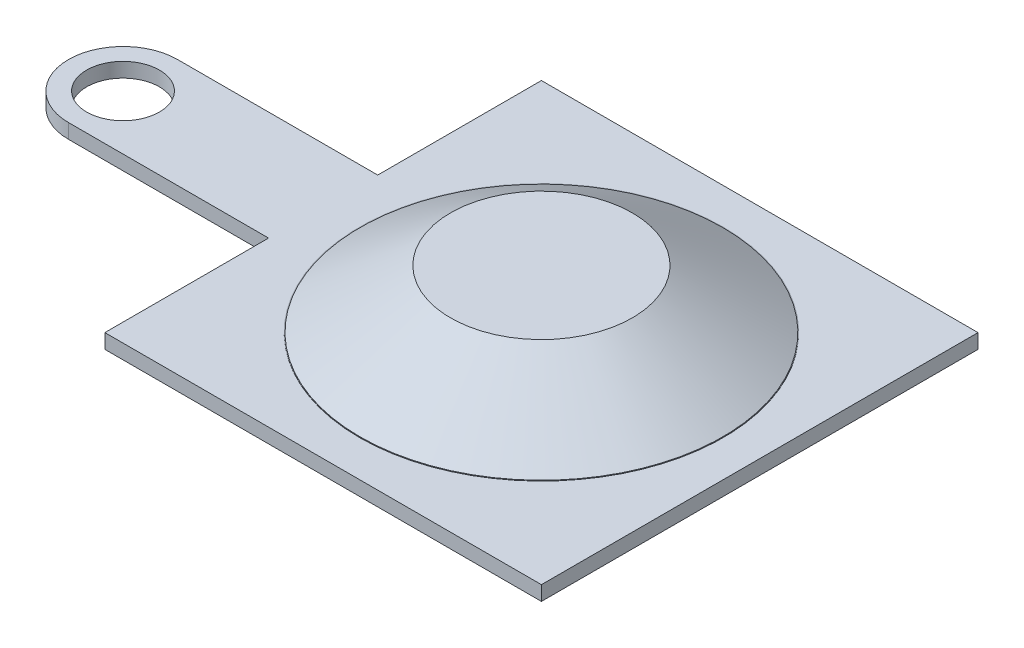
ISO-10303-21;
HEADER;
FILE_DESCRIPTION(('STEP AP214'),'2;1');
FILE_NAME('part.step','',(''),(''),'','','');
FILE_SCHEMA(('AUTOMOTIVE_DESIGN { 1 0 10303 214 1 1 1 1 }'));
ENDSEC;
DATA;
#1=APPLICATION_CONTEXT('core data for automotive mechanical design processes');
#2=APPLICATION_PROTOCOL_DEFINITION('international standard','automotive_design',2000,#1);
#3=PRODUCT_CONTEXT('',#1,'mechanical');
#4=PRODUCT('Part','Part','',(#3));
#5=PRODUCT_RELATED_PRODUCT_CATEGORY('part','',(#4));
#6=PRODUCT_DEFINITION_FORMATION('','',#4);
#7=PRODUCT_DEFINITION_CONTEXT('part definition',#1,'design');
#8=PRODUCT_DEFINITION('design','',#6,#7);
#9=PRODUCT_DEFINITION_SHAPE('','',#8);
#10=(LENGTH_UNIT() NAMED_UNIT(*) SI_UNIT(.MILLI.,.METRE.));
#11=(NAMED_UNIT(*) PLANE_ANGLE_UNIT() SI_UNIT($,.RADIAN.));
#12=(NAMED_UNIT(*) SI_UNIT($,.STERADIAN.) SOLID_ANGLE_UNIT());
#13=UNCERTAINTY_MEASURE_WITH_UNIT(LENGTH_MEASURE(1.E-05),#10,'distance_accuracy_value','');
#14=(GEOMETRIC_REPRESENTATION_CONTEXT(3) GLOBAL_UNCERTAINTY_ASSIGNED_CONTEXT((#13)) GLOBAL_UNIT_ASSIGNED_CONTEXT((#10,
#11,#12)) REPRESENTATION_CONTEXT('',''));
#15=CARTESIAN_POINT('',(0.,0.,0.));
#16=DIRECTION('',(0.,0.,1.));
#17=DIRECTION('',(1.,0.,0.));
#18=AXIS2_PLACEMENT_3D('',#15,#16,#17);
#19=CARTESIAN_POINT('',(6.,0.4,6.));
#20=DIRECTION('',(-1.,0.,0.));
#21=DIRECTION('',(0.,0.,1.));
#22=AXIS2_PLACEMENT_3D('',#19,#20,#21);
#23=PLANE('',#22);
#24=DIRECTION('',(0.,0.,-1.));
#25=VECTOR('',#24,1.);
#26=CARTESIAN_POINT('',(6.,0.,6.));
#27=LINE('',#26,#25);
#28=CARTESIAN_POINT('',(6.,0.,6.));
#29=VERTEX_POINT('',#28);
#30=CARTESIAN_POINT('',(6.,0.,-6.));
#31=VERTEX_POINT('',#30);
#32=EDGE_CURVE('E184',#29,#31,#27,.T.);
#33=ORIENTED_EDGE('',*,*,#32,.T.);
#34=DIRECTION('',(0.,-1.,0.));
#35=VECTOR('',#34,1.);
#36=CARTESIAN_POINT('',(6.,0.4,-6.));
#37=LINE('',#36,#35);
#38=CARTESIAN_POINT('',(6.,0.4,-6.));
#39=VERTEX_POINT('',#38);
#40=EDGE_CURVE('E165',#39,#31,#37,.T.);
#41=ORIENTED_EDGE('',*,*,#40,.F.);
#42=DIRECTION('',(0.,0.,-1.));
#43=VECTOR('',#42,1.);
#44=CARTESIAN_POINT('',(6.,0.4,6.));
#45=LINE('',#44,#43);
#46=CARTESIAN_POINT('',(6.,0.4,6.));
#47=VERTEX_POINT('',#46);
#48=EDGE_CURVE('E171',#47,#39,#45,.T.);
#49=ORIENTED_EDGE('',*,*,#48,.F.);
#50=DIRECTION('',(0.,-1.,0.));
#51=VECTOR('',#50,1.);
#52=CARTESIAN_POINT('',(6.,0.4,6.));
#53=LINE('',#52,#51);
#54=EDGE_CURVE('E191',#47,#29,#53,.T.);
#55=ORIENTED_EDGE('',*,*,#54,.T.);
#56=EDGE_LOOP('',(#33,#41,#49,#55));
#57=FACE_BOUND('',#56,.T.);
#58=ADVANCED_FACE('F76',(#57),#23,.F.);
#59=CARTESIAN_POINT('',(-6.,0.4,-6.));
#60=DIRECTION('',(0.,0.,-1.));
#61=DIRECTION('',(-1.,0.,0.));
#62=AXIS2_PLACEMENT_3D('',#59,#60,#61);
#63=PLANE('',#62);
#64=DIRECTION('',(1.,0.,0.));
#65=VECTOR('',#64,1.);
#66=CARTESIAN_POINT('',(-6.,0.,-6.));
#67=LINE('',#66,#65);
#68=CARTESIAN_POINT('',(-6.,0.,-6.));
#69=VERTEX_POINT('',#68);
#70=EDGE_CURVE('E164',#69,#31,#67,.T.);
#71=ORIENTED_EDGE('',*,*,#70,.F.);
#72=DIRECTION('',(0.,-1.,0.));
#73=VECTOR('',#72,1.);
#74=CARTESIAN_POINT('',(-6.,0.4,-6.));
#75=LINE('',#74,#73);
#76=CARTESIAN_POINT('',(-6.,0.4,-6.));
#77=VERTEX_POINT('',#76);
#78=EDGE_CURVE('E152',#77,#69,#75,.T.);
#79=ORIENTED_EDGE('',*,*,#78,.F.);
#80=DIRECTION('',(1.,0.,0.));
#81=VECTOR('',#80,1.);
#82=CARTESIAN_POINT('',(-6.,0.4,-6.));
#83=LINE('',#82,#81);
#84=EDGE_CURVE('E162',#77,#39,#83,.T.);
#85=ORIENTED_EDGE('',*,*,#84,.T.);
#86=ORIENTED_EDGE('',*,*,#40,.T.);
#87=EDGE_LOOP('',(#71,#79,#85,#86));
#88=FACE_BOUND('',#87,.T.);
#89=ADVANCED_FACE('F161',(#88),#63,.T.);
#90=CARTESIAN_POINT('',(-6.,0.4,6.));
#91=DIRECTION('',(0.,0.,-1.));
#92=DIRECTION('',(-1.,0.,0.));
#93=AXIS2_PLACEMENT_3D('',#90,#91,#92);
#94=PLANE('',#93);
#95=DIRECTION('',(1.,0.,0.));
#96=VECTOR('',#95,1.);
#97=CARTESIAN_POINT('',(-6.,0.,6.));
#98=LINE('',#97,#96);
#99=CARTESIAN_POINT('',(-6.,0.,6.));
#100=VERTEX_POINT('',#99);
#101=EDGE_CURVE('E157',#100,#29,#98,.T.);
#102=ORIENTED_EDGE('',*,*,#101,.T.);
#103=ORIENTED_EDGE('',*,*,#54,.F.);
#104=DIRECTION('',(1.,0.,0.));
#105=VECTOR('',#104,1.);
#106=CARTESIAN_POINT('',(-6.,0.4,6.));
#107=LINE('',#106,#105);
#108=CARTESIAN_POINT('',(-6.,0.4,6.));
#109=VERTEX_POINT('',#108);
#110=EDGE_CURVE('E166',#109,#47,#107,.T.);
#111=ORIENTED_EDGE('',*,*,#110,.F.);
#112=DIRECTION('',(0.,-1.,0.));
#113=VECTOR('',#112,1.);
#114=CARTESIAN_POINT('',(-6.,0.4,6.));
#115=LINE('',#114,#113);
#116=EDGE_CURVE('E188',#109,#100,#115,.T.);
#117=ORIENTED_EDGE('',*,*,#116,.T.);
#118=EDGE_LOOP('',(#102,#103,#111,#117));
#119=FACE_BOUND('',#118,.T.);
#120=ADVANCED_FACE('F272',(#119),#94,.F.);
#121=CARTESIAN_POINT('',(0.,0.,0.));
#122=DIRECTION('',(0.,-1.,0.));
#123=DIRECTION('',(0.,0.,-1.));
#124=AXIS2_PLACEMENT_3D('',#121,#122,#123);
#125=PLANE('',#124);
#126=DIRECTION('',(-1.,0.,0.));
#127=VECTOR('',#126,1.);
#128=CARTESIAN_POINT('',(-6.,0.,1.5));
#129=LINE('',#128,#127);
#130=CARTESIAN_POINT('',(-6.,0.,1.5));
#131=VERTEX_POINT('',#130);
#132=CARTESIAN_POINT('',(-11.5,0.,1.5));
#133=VERTEX_POINT('',#132);
#134=EDGE_CURVE('E198',#131,#133,#129,.T.);
#135=ORIENTED_EDGE('',*,*,#134,.T.);
#136=CARTESIAN_POINT('',(-11.5,0.,0.));
#137=DIRECTION('',(0.,-1.,0.));
#138=DIRECTION('',(0.,0.,-1.));
#139=AXIS2_PLACEMENT_3D('',#136,#137,#138);
#140=CIRCLE('',#139,1.5);
#141=CARTESIAN_POINT('',(-13.,0.,0.));
#142=VERTEX_POINT('',#141);
#143=EDGE_CURVE('E219',#133,#142,#140,.T.);
#144=ORIENTED_EDGE('',*,*,#143,.T.);
#145=CARTESIAN_POINT('',(-11.5,0.,0.));
#146=DIRECTION('',(0.,-1.,0.));
#147=DIRECTION('',(0.,0.,-1.));
#148=AXIS2_PLACEMENT_3D('',#145,#146,#147);
#149=CIRCLE('',#148,1.5);
#150=CARTESIAN_POINT('',(-11.5,0.,-1.5));
#151=VERTEX_POINT('',#150);
#152=EDGE_CURVE('E217',#142,#151,#149,.T.);
#153=ORIENTED_EDGE('',*,*,#152,.T.);
#154=DIRECTION('',(-1.,0.,0.));
#155=VECTOR('',#154,1.);
#156=CARTESIAN_POINT('',(-6.,0.,-1.5));
#157=LINE('',#156,#155);
#158=CARTESIAN_POINT('',(-6.,0.,-1.5));
#159=VERTEX_POINT('',#158);
#160=EDGE_CURVE('E207',#159,#151,#157,.T.);
#161=ORIENTED_EDGE('',*,*,#160,.F.);
#162=DIRECTION('',(0.,0.,-1.));
#163=VECTOR('',#162,1.);
#164=CARTESIAN_POINT('',(-6.,0.,6.));
#165=LINE('',#164,#163);
#166=EDGE_CURVE('E182',#159,#69,#165,.T.);
#167=ORIENTED_EDGE('',*,*,#166,.T.);
#168=ORIENTED_EDGE('',*,*,#70,.T.);
#169=ORIENTED_EDGE('',*,*,#32,.F.);
#170=ORIENTED_EDGE('',*,*,#101,.F.);
#171=EDGE_CURVE('E179',#100,#131,#165,.T.);
#172=ORIENTED_EDGE('',*,*,#171,.T.);
#173=EDGE_LOOP('',(#135,#144,#153,#161,#167,#168,#169,#170,#172));
#174=FACE_BOUND('',#173,.T.);
#175=CARTESIAN_POINT('',(-11.5,0.,0.));
#176=DIRECTION('',(0.,1.,0.));
#177=DIRECTION('',(0.,0.,1.));
#178=AXIS2_PLACEMENT_3D('',#175,#176,#177);
#179=CIRCLE('',#178,1.);
#180=CARTESIAN_POINT('',(-11.5,0.,1.));
#181=VERTEX_POINT('',#180);
#182=EDGE_CURVE('E199',#181,#181,#179,.T.);
#183=ORIENTED_EDGE('',*,*,#182,.T.);
#184=EDGE_LOOP('',(#183));
#185=FACE_BOUND('',#184,.T.);
#186=ADVANCED_FACE('F234',(#174,#185),#125,.T.);
#187=CARTESIAN_POINT('',(0.,0.4,0.));
#188=DIRECTION('',(0.,-1.,0.));
#189=DIRECTION('',(0.,0.,-1.));
#190=AXIS2_PLACEMENT_3D('',#187,#188,#189);
#191=PLANE('',#190);
#192=CARTESIAN_POINT('',(0.,0.4,0.));
#193=DIRECTION('',(0.,-1.,0.));
#194=DIRECTION('',(0.,0.,-1.));
#195=AXIS2_PLACEMENT_3D('',#192,#193,#194);
#196=CIRCLE('',#195,5.);
#197=CARTESIAN_POINT('',(0.,0.4,-5.));
#198=VERTEX_POINT('',#197);
#199=EDGE_CURVE('E240',#198,#198,#196,.T.);
#200=ORIENTED_EDGE('',*,*,#199,.T.);
#201=EDGE_LOOP('',(#200));
#202=FACE_BOUND('',#201,.T.);
#203=CARTESIAN_POINT('',(-11.5,0.4,0.));
#204=DIRECTION('',(0.,-1.,0.));
#205=DIRECTION('',(0.,0.,-1.));
#206=AXIS2_PLACEMENT_3D('',#203,#204,#205);
#207=CIRCLE('',#206,1.5);
#208=CARTESIAN_POINT('',(-11.5,0.4,-1.5));
#209=VERTEX_POINT('',#208);
#210=CARTESIAN_POINT('',(-13.,0.4,0.));
#211=VERTEX_POINT('',#210);
#212=EDGE_CURVE('E92',#209,#211,#207,.F.);
#213=ORIENTED_EDGE('',*,*,#212,.T.);
#214=CARTESIAN_POINT('',(-11.5,0.4,0.));
#215=DIRECTION('',(0.,-1.,0.));
#216=DIRECTION('',(0.,0.,-1.));
#217=AXIS2_PLACEMENT_3D('',#214,#215,#216);
#218=CIRCLE('',#217,1.5);
#219=CARTESIAN_POINT('',(-11.5,0.4,1.5));
#220=VERTEX_POINT('',#219);
#221=EDGE_CURVE('E85',#211,#220,#218,.F.);
#222=ORIENTED_EDGE('',*,*,#221,.T.);
#223=DIRECTION('',(-1.,0.,0.));
#224=VECTOR('',#223,1.);
#225=CARTESIAN_POINT('',(-6.,0.4,1.5));
#226=LINE('',#225,#224);
#227=CARTESIAN_POINT('',(-6.,0.4,1.5));
#228=VERTEX_POINT('',#227);
#229=EDGE_CURVE('E203',#228,#220,#226,.T.);
#230=ORIENTED_EDGE('',*,*,#229,.F.);
#231=DIRECTION('',(0.,0.,-1.));
#232=VECTOR('',#231,1.);
#233=CARTESIAN_POINT('',(-6.,0.4,6.));
#234=LINE('',#233,#232);
#235=EDGE_CURVE('E156',#109,#228,#234,.T.);
#236=ORIENTED_EDGE('',*,*,#235,.F.);
#237=ORIENTED_EDGE('',*,*,#110,.T.);
#238=ORIENTED_EDGE('',*,*,#48,.T.);
#239=ORIENTED_EDGE('',*,*,#84,.F.);
#240=CARTESIAN_POINT('',(-6.,0.4,-1.5));
#241=VERTEX_POINT('',#240);
#242=EDGE_CURVE('E148',#241,#77,#234,.T.);
#243=ORIENTED_EDGE('',*,*,#242,.F.);
#244=DIRECTION('',(-1.,0.,0.));
#245=VECTOR('',#244,1.);
#246=CARTESIAN_POINT('',(-6.,0.4,-1.5));
#247=LINE('',#246,#245);
#248=EDGE_CURVE('E206',#241,#209,#247,.T.);
#249=ORIENTED_EDGE('',*,*,#248,.T.);
#250=EDGE_LOOP('',(#213,#222,#230,#236,#237,#238,#239,#243,#249));
#251=FACE_BOUND('',#250,.T.);
#252=CARTESIAN_POINT('',(-11.5,0.4,0.));
#253=DIRECTION('',(0.,1.,0.));
#254=DIRECTION('',(0.,0.,1.));
#255=AXIS2_PLACEMENT_3D('',#252,#253,#254);
#256=CIRCLE('',#255,1.);
#257=CARTESIAN_POINT('',(-11.5,0.4,1.));
#258=VERTEX_POINT('',#257);
#259=EDGE_CURVE('E195',#258,#258,#256,.T.);
#260=ORIENTED_EDGE('',*,*,#259,.F.);
#261=EDGE_LOOP('',(#260));
#262=FACE_BOUND('',#261,.T.);
#263=ADVANCED_FACE('F168',(#202,#251,#262),#191,.F.);
#264=CARTESIAN_POINT('',(-6.,0.4,6.));
#265=DIRECTION('',(-1.,0.,0.));
#266=DIRECTION('',(0.,0.,1.));
#267=AXIS2_PLACEMENT_3D('',#264,#265,#266);
#268=PLANE('',#267);
#269=ORIENTED_EDGE('',*,*,#235,.T.);
#270=DIRECTION('',(0.,-1.,0.));
#271=VECTOR('',#270,1.);
#272=CARTESIAN_POINT('',(-6.,0.4,1.5));
#273=LINE('',#272,#271);
#274=EDGE_CURVE('E190',#228,#131,#273,.T.);
#275=ORIENTED_EDGE('',*,*,#274,.T.);
#276=ORIENTED_EDGE('',*,*,#171,.F.);
#277=ORIENTED_EDGE('',*,*,#116,.F.);
#278=EDGE_LOOP('',(#269,#275,#276,#277));
#279=FACE_BOUND('',#278,.T.);
#280=ADVANCED_FACE('F280',(#279),#268,.T.);
#281=DIRECTION('',(0.,-1.,0.));
#282=VECTOR('',#281,1.);
#283=CARTESIAN_POINT('',(-6.,0.4,-1.5));
#284=LINE('',#283,#282);
#285=EDGE_CURVE('E154',#241,#159,#284,.T.);
#286=ORIENTED_EDGE('',*,*,#285,.F.);
#287=ORIENTED_EDGE('',*,*,#242,.T.);
#288=ORIENTED_EDGE('',*,*,#78,.T.);
#289=ORIENTED_EDGE('',*,*,#166,.F.);
#290=EDGE_LOOP('',(#286,#287,#288,#289));
#291=FACE_BOUND('',#290,.T.);
#292=ADVANCED_FACE('F150',(#291),#268,.T.);
#293=CARTESIAN_POINT('',(-11.5,0.4,0.));
#294=DIRECTION('',(0.,-1.,0.));
#295=DIRECTION('',(0.,0.,-1.));
#296=AXIS2_PLACEMENT_3D('',#293,#294,#295);
#297=CYLINDRICAL_SURFACE('',#296,1.);
#298=ORIENTED_EDGE('',*,*,#259,.T.);
#299=EDGE_LOOP('',(#298));
#300=FACE_BOUND('',#299,.T.);
#301=ORIENTED_EDGE('',*,*,#182,.F.);
#302=EDGE_LOOP('',(#301));
#303=FACE_BOUND('',#302,.T.);
#304=ADVANCED_FACE('F279',(#300,#303),#297,.F.);
#305=CARTESIAN_POINT('',(-6.,0.4,1.5));
#306=DIRECTION('',(0.,0.,1.));
#307=DIRECTION('',(1.,0.,0.));
#308=AXIS2_PLACEMENT_3D('',#305,#306,#307);
#309=PLANE('',#308);
#310=ORIENTED_EDGE('',*,*,#229,.T.);
#311=DIRECTION('',(0.,-1.,0.));
#312=VECTOR('',#311,1.);
#313=CARTESIAN_POINT('',(-11.5,0.,1.5));
#314=LINE('',#313,#312);
#315=EDGE_CURVE('E213',#220,#133,#314,.T.);
#316=ORIENTED_EDGE('',*,*,#315,.T.);
#317=ORIENTED_EDGE('',*,*,#134,.F.);
#318=ORIENTED_EDGE('',*,*,#274,.F.);
#319=EDGE_LOOP('',(#310,#316,#317,#318));
#320=FACE_BOUND('',#319,.T.);
#321=ADVANCED_FACE('F229',(#320),#309,.T.);
#322=CARTESIAN_POINT('',(-6.,0.4,-1.5));
#323=DIRECTION('',(0.,0.,1.));
#324=DIRECTION('',(1.,0.,0.));
#325=AXIS2_PLACEMENT_3D('',#322,#323,#324);
#326=PLANE('',#325);
#327=ORIENTED_EDGE('',*,*,#160,.T.);
#328=DIRECTION('',(0.,-1.,0.));
#329=VECTOR('',#328,1.);
#330=CARTESIAN_POINT('',(-11.5,0.4,-1.5));
#331=LINE('',#330,#329);
#332=EDGE_CURVE('E12',#151,#209,#331,.F.);
#333=ORIENTED_EDGE('',*,*,#332,.T.);
#334=ORIENTED_EDGE('',*,*,#248,.F.);
#335=ORIENTED_EDGE('',*,*,#285,.T.);
#336=EDGE_LOOP('',(#327,#333,#334,#335));
#337=FACE_BOUND('',#336,.T.);
#338=ADVANCED_FACE('F281',(#337),#326,.F.);
#339=CARTESIAN_POINT('',(0.,0.41,0.));
#340=DIRECTION('',(0.,-1.,0.));
#341=DIRECTION('',(0.,0.,-1.));
#342=AXIS2_PLACEMENT_3D('',#339,#340,#341);
#343=CYLINDRICAL_SURFACE('',#342,5.);
#344=CARTESIAN_POINT('',(0.,0.41,0.));
#345=DIRECTION('',(0.,-1.,0.));
#346=DIRECTION('',(0.,0.,-1.));
#347=AXIS2_PLACEMENT_3D('',#344,#345,#346);
#348=CIRCLE('',#347,5.);
#349=CARTESIAN_POINT('',(0.,0.41,-5.));
#350=VERTEX_POINT('',#349);
#351=EDGE_CURVE('E245',#350,#350,#348,.T.);
#352=CARTESIAN_POINT('',(0.,0.41,-5.));
#353=CARTESIAN_POINT('',(0.,0.409895833333333,-5.));
#354=CARTESIAN_POINT('',(0.,0.409791666666667,-5.));
#355=CARTESIAN_POINT('',(0.,0.409583333333333,-5.));
#356=CARTESIAN_POINT('',(0.,0.409479166666667,-5.));
#357=CARTESIAN_POINT('',(0.,0.409270833333333,-5.));
#358=CARTESIAN_POINT('',(0.,0.409166666666667,-5.));
#359=CARTESIAN_POINT('',(0.,0.408958333333333,-5.));
#360=CARTESIAN_POINT('',(0.,0.408854166666667,-5.));
#361=CARTESIAN_POINT('',(0.,0.408645833333333,-5.));
#362=CARTESIAN_POINT('',(0.,0.408541666666667,-5.));
#363=CARTESIAN_POINT('',(0.,0.408333333333333,-5.));
#364=CARTESIAN_POINT('',(0.,0.408229166666667,-5.));
#365=CARTESIAN_POINT('',(0.,0.408020833333333,-5.));
#366=CARTESIAN_POINT('',(0.,0.407916666666667,-5.));
#367=CARTESIAN_POINT('',(0.,0.407708333333333,-5.));
#368=CARTESIAN_POINT('',(0.,0.407604166666667,-5.));
#369=CARTESIAN_POINT('',(0.,0.407395833333333,-5.));
#370=CARTESIAN_POINT('',(0.,0.407291666666667,-5.));
#371=CARTESIAN_POINT('',(0.,0.407083333333333,-5.));
#372=CARTESIAN_POINT('',(0.,0.406979166666667,-5.));
#373=CARTESIAN_POINT('',(0.,0.406770833333333,-5.));
#374=CARTESIAN_POINT('',(0.,0.406666666666667,-5.));
#375=CARTESIAN_POINT('',(0.,0.406458333333333,-5.));
#376=CARTESIAN_POINT('',(0.,0.406354166666667,-5.));
#377=CARTESIAN_POINT('',(0.,0.406145833333333,-5.));
#378=CARTESIAN_POINT('',(0.,0.406041666666667,-5.));
#379=CARTESIAN_POINT('',(0.,0.405833333333333,-5.));
#380=CARTESIAN_POINT('',(0.,0.405729166666667,-5.));
#381=CARTESIAN_POINT('',(0.,0.405520833333333,-5.));
#382=CARTESIAN_POINT('',(0.,0.405416666666667,-5.));
#383=CARTESIAN_POINT('',(0.,0.405208333333333,-5.));
#384=CARTESIAN_POINT('',(0.,0.405104166666667,-5.));
#385=CARTESIAN_POINT('',(0.,0.404895833333333,-5.));
#386=CARTESIAN_POINT('',(0.,0.404791666666667,-5.));
#387=CARTESIAN_POINT('',(0.,0.404583333333333,-5.));
#388=CARTESIAN_POINT('',(0.,0.404479166666667,-5.));
#389=CARTESIAN_POINT('',(0.,0.404270833333333,-5.));
#390=CARTESIAN_POINT('',(0.,0.404166666666667,-5.));
#391=CARTESIAN_POINT('',(0.,0.403958333333333,-5.));
#392=CARTESIAN_POINT('',(0.,0.403854166666667,-5.));
#393=CARTESIAN_POINT('',(0.,0.403645833333333,-5.));
#394=CARTESIAN_POINT('',(0.,0.403541666666667,-5.));
#395=CARTESIAN_POINT('',(0.,0.403333333333333,-5.));
#396=CARTESIAN_POINT('',(0.,0.403229166666667,-5.));
#397=CARTESIAN_POINT('',(0.,0.403020833333333,-5.));
#398=CARTESIAN_POINT('',(0.,0.402916666666667,-5.));
#399=CARTESIAN_POINT('',(0.,0.402708333333333,-5.));
#400=CARTESIAN_POINT('',(0.,0.402604166666667,-5.));
#401=CARTESIAN_POINT('',(0.,0.402395833333333,-5.));
#402=CARTESIAN_POINT('',(0.,0.402291666666667,-5.));
#403=CARTESIAN_POINT('',(0.,0.402083333333333,-5.));
#404=CARTESIAN_POINT('',(0.,0.401979166666667,-5.));
#405=CARTESIAN_POINT('',(0.,0.401770833333333,-5.));
#406=CARTESIAN_POINT('',(0.,0.401666666666667,-5.));
#407=CARTESIAN_POINT('',(0.,0.401458333333333,-5.));
#408=CARTESIAN_POINT('',(0.,0.401354166666667,-5.));
#409=CARTESIAN_POINT('',(0.,0.401145833333333,-5.));
#410=CARTESIAN_POINT('',(0.,0.401041666666667,-5.));
#411=CARTESIAN_POINT('',(0.,0.400833333333333,-5.));
#412=CARTESIAN_POINT('',(0.,0.400729166666667,-5.));
#413=CARTESIAN_POINT('',(0.,0.400520833333333,-5.));
#414=CARTESIAN_POINT('',(0.,0.400416666666667,-5.));
#415=CARTESIAN_POINT('',(0.,0.400208333333333,-5.));
#416=CARTESIAN_POINT('',(0.,0.400104166666667,-5.));
#417=CARTESIAN_POINT('',(0.,0.4,-5.));
#418=B_SPLINE_CURVE_WITH_KNOTS('',3,(#352,#353,#354,#355,#356,#357,#358,#359,#360,#361,#362,
#363,#364,#365,#366,#367,#368,#369,#370,#371,#372,#373,#374,#375,#376,#377,#378,#379,#380,#381,
#382,#383,#384,#385,#386,#387,#388,#389,#390,#391,#392,#393,#394,#395,#396,#397,#398,#399,#400,
#401,#402,#403,#404,#405,#406,#407,#408,#409,#410,#411,#412,#413,#414,#415,#416,#417),
.UNSPECIFIED.,.F.,.F.,(4,2,2,2,2,2,2,2,2,2,2,2,2,2,2,2,2,2,2,2,2,2,2,2,2,2,2,2,2,2,2,2,4),(0.,
0.000312500000000041,0.000625000000000029,0.000937500000000016,0.00125000000000006,
0.00156250000000004,0.00187500000000003,0.00218750000000002,0.00250000000000006,
0.00281250000000005,0.00312500000000004,0.00343750000000002,0.00375000000000006,
0.00406250000000005,0.00437500000000004,0.00468750000000003,0.00500000000000007,
0.00531250000000006,0.00562500000000004,0.00593750000000003,0.00625000000000007,
0.00656250000000006,0.00687500000000005,0.00718750000000003,0.00750000000000007,
0.00781250000000006,0.00812500000000005,0.00843750000000004,0.00875000000000008,
0.00906250000000006,0.00937500000000005,0.00968750000000004,0.0100000000000001),.UNSPECIFIED.);
#419=EDGE_CURVE('BSEAM285',#350,#198,#418,.T.);
#420=ORIENTED_EDGE('',*,*,#351,.T.);
#421=ORIENTED_EDGE('',*,*,#199,.F.);
#422=ORIENTED_EDGE('',*,*,#419,.T.);
#423=ORIENTED_EDGE('',*,*,#419,.F.);
#424=EDGE_LOOP('',(#420,#422,#421,#423));
#425=FACE_BOUND('',#424,.T.);
#426=ADVANCED_FACE('F285',(#425),#343,.T.);
#427=CARTESIAN_POINT('',(0.,0.41,0.));
#428=DIRECTION('',(0.,-1.,0.));
#429=DIRECTION('',(0.,0.,-1.));
#430=AXIS2_PLACEMENT_3D('',#427,#428,#429);
#431=PLANE('',#430);
#432=CARTESIAN_POINT('',(0.,0.41,0.));
#433=DIRECTION('',(0.,-1.,0.));
#434=DIRECTION('',(0.,0.,-1.));
#435=AXIS2_PLACEMENT_3D('',#432,#433,#434);
#436=CIRCLE('',#435,4.984375);
#437=CARTESIAN_POINT('',(0.,0.41,-4.984375));
#438=VERTEX_POINT('',#437);
#439=EDGE_CURVE('E238',#438,#438,#436,.T.);
#440=ORIENTED_EDGE('',*,*,#439,.T.);
#441=EDGE_LOOP('',(#440));
#442=FACE_BOUND('',#441,.T.);
#443=ORIENTED_EDGE('',*,*,#351,.F.);
#444=EDGE_LOOP('',(#443));
#445=FACE_BOUND('',#444,.T.);
#446=ADVANCED_FACE('F262',(#442,#445),#431,.F.);
#447=CARTESIAN_POINT('',(0.,2.,0.));
#448=DIRECTION('',(0.,-1.,0.));
#449=DIRECTION('',(0.,0.,-1.));
#450=AXIS2_PLACEMENT_3D('',#447,#448,#449);
#451=CONICAL_SURFACE('',#450,2.5,1.00148313569423);
#452=CARTESIAN_POINT('',(0.,2.,0.));
#453=DIRECTION('',(0.,-1.,0.));
#454=DIRECTION('',(0.,0.,-1.));
#455=AXIS2_PLACEMENT_3D('',#452,#453,#454);
#456=CIRCLE('',#455,2.5);
#457=CARTESIAN_POINT('',(0.,2.,-2.5));
#458=VERTEX_POINT('',#457);
#459=EDGE_CURVE('E202',#458,#458,#456,.T.);
#460=ORIENTED_EDGE('',*,*,#459,.T.);
#461=EDGE_LOOP('',(#460));
#462=FACE_BOUND('',#461,.T.);
#463=ORIENTED_EDGE('',*,*,#439,.F.);
#464=EDGE_LOOP('',(#463));
#465=FACE_BOUND('',#464,.T.);
#466=ADVANCED_FACE('F252',(#462,#465),#451,.T.);
#467=CARTESIAN_POINT('',(0.,2.,0.));
#468=DIRECTION('',(0.,-1.,0.));
#469=DIRECTION('',(0.,0.,-1.));
#470=AXIS2_PLACEMENT_3D('',#467,#468,#469);
#471=PLANE('',#470);
#472=ORIENTED_EDGE('',*,*,#459,.F.);
#473=EDGE_LOOP('',(#472));
#474=FACE_BOUND('',#473,.T.);
#475=ADVANCED_FACE('F255',(#474),#471,.F.);
#476=CARTESIAN_POINT('',(-11.5,0.4,0.));
#477=DIRECTION('',(0.,-1.,0.));
#478=DIRECTION('',(0.,0.,-1.));
#479=AXIS2_PLACEMENT_3D('',#476,#477,#478);
#480=CYLINDRICAL_SURFACE('',#479,1.5);
#481=DIRECTION('',(0.,-1.,0.));
#482=VECTOR('',#481,1.);
#483=CARTESIAN_POINT('',(-13.,0.4,0.));
#484=LINE('',#483,#482);
#485=EDGE_CURVE('E80',#211,#142,#484,.T.);
#486=ORIENTED_EDGE('',*,*,#485,.F.);
#487=ORIENTED_EDGE('',*,*,#212,.F.);
#488=ORIENTED_EDGE('',*,*,#332,.F.);
#489=ORIENTED_EDGE('',*,*,#152,.F.);
#490=EDGE_LOOP('',(#486,#487,#488,#489));
#491=FACE_BOUND('',#490,.T.);
#492=ADVANCED_FACE('F78',(#491),#480,.T.);
#493=CARTESIAN_POINT('',(-11.5,0.4,0.));
#494=DIRECTION('',(0.,1.,0.));
#495=DIRECTION('',(0.,0.,1.));
#496=AXIS2_PLACEMENT_3D('',#493,#494,#495);
#497=CYLINDRICAL_SURFACE('',#496,1.5);
#498=ORIENTED_EDGE('',*,*,#221,.F.);
#499=ORIENTED_EDGE('',*,*,#485,.T.);
#500=ORIENTED_EDGE('',*,*,#143,.F.);
#501=ORIENTED_EDGE('',*,*,#315,.F.);
#502=EDGE_LOOP('',(#498,#499,#500,#501));
#503=FACE_BOUND('',#502,.T.);
#504=ADVANCED_FACE('F231',(#503),#497,.T.);
#505=CLOSED_SHELL('',(#58,#89,#120,#186,#263,#280,#292,#304,#321,#338,#426,#446,#466,#475,#492,#504));
#506=MANIFOLD_SOLID_BREP('B2',#505);
#507=ADVANCED_BREP_SHAPE_REPRESENTATION('',(#18,#506),#14);
#508=SHAPE_DEFINITION_REPRESENTATION(#9,#507);
ENDSEC;
END-ISO-10303-21;
